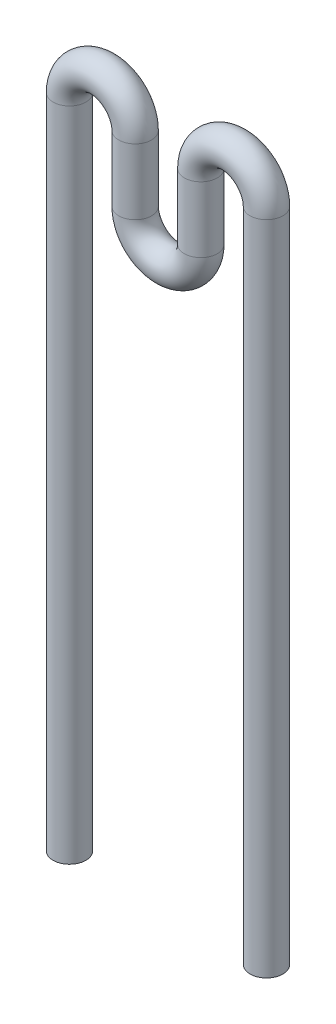
ISO-10303-21;
HEADER;
FILE_DESCRIPTION(('STEP AP214'),'2;1');
FILE_NAME('part.step','',(''),(''),'','','');
FILE_SCHEMA(('AUTOMOTIVE_DESIGN { 1 0 10303 214 1 1 1 1 }'));
ENDSEC;
DATA;
#1=APPLICATION_CONTEXT('core data for automotive mechanical design processes');
#2=APPLICATION_PROTOCOL_DEFINITION('international standard','automotive_design',2000,#1);
#3=PRODUCT_CONTEXT('',#1,'mechanical');
#4=PRODUCT('Part','Part','',(#3));
#5=PRODUCT_RELATED_PRODUCT_CATEGORY('part','',(#4));
#6=PRODUCT_DEFINITION_FORMATION('','',#4);
#7=PRODUCT_DEFINITION_CONTEXT('part definition',#1,'design');
#8=PRODUCT_DEFINITION('design','',#6,#7);
#9=PRODUCT_DEFINITION_SHAPE('','',#8);
#10=(LENGTH_UNIT() NAMED_UNIT(*) SI_UNIT(.MILLI.,.METRE.));
#11=(NAMED_UNIT(*) PLANE_ANGLE_UNIT() SI_UNIT($,.RADIAN.));
#12=(NAMED_UNIT(*) SI_UNIT($,.STERADIAN.) SOLID_ANGLE_UNIT());
#13=UNCERTAINTY_MEASURE_WITH_UNIT(LENGTH_MEASURE(1.E-05),#10,'distance_accuracy_value','');
#14=(GEOMETRIC_REPRESENTATION_CONTEXT(3) GLOBAL_UNCERTAINTY_ASSIGNED_CONTEXT((#13)) GLOBAL_UNIT_ASSIGNED_CONTEXT((#10,
#11,#12)) REPRESENTATION_CONTEXT('',''));
#15=CARTESIAN_POINT('',(0.,0.,0.));
#16=DIRECTION('',(0.,0.,1.));
#17=DIRECTION('',(1.,0.,0.));
#18=AXIS2_PLACEMENT_3D('',#15,#16,#17);
#19=CARTESIAN_POINT('',(0.,0.,0.));
#20=DIRECTION('',(0.,1.,0.));
#21=DIRECTION('',(0.,0.,1.));
#22=AXIS2_PLACEMENT_3D('',#19,#20,#21);
#23=PLANE('',#22);
#24=CARTESIAN_POINT('',(0.,0.,0.));
#25=DIRECTION('',(0.,1.,0.));
#26=DIRECTION('',(0.,0.,1.));
#27=AXIS2_PLACEMENT_3D('',#24,#25,#26);
#28=CIRCLE('',#27,5.);
#29=CARTESIAN_POINT('',(0.,0.,5.));
#30=VERTEX_POINT('',#29);
#31=EDGE_CURVE('E63',#30,#30,#28,.T.);
#32=ORIENTED_EDGE('',*,*,#31,.F.);
#33=EDGE_LOOP('',(#32));
#34=FACE_BOUND('',#33,.T.);
#35=ADVANCED_FACE('F35',(#34),#23,.F.);
#36=CARTESIAN_POINT('',(60.0000000000001,0.,0.));
#37=DIRECTION('',(0.,-1.,0.));
#38=DIRECTION('',(0.,0.,1.));
#39=AXIS2_PLACEMENT_3D('',#36,#37,#38);
#40=PLANE('',#39);
#41=CARTESIAN_POINT('',(60.0000000000001,0.,0.));
#42=DIRECTION('',(0.,-1.,0.));
#43=DIRECTION('',(0.,0.,1.));
#44=AXIS2_PLACEMENT_3D('',#41,#42,#43);
#45=CIRCLE('',#44,5.);
#46=CARTESIAN_POINT('',(60.0000000000001,0.,5.));
#47=VERTEX_POINT('',#46);
#48=EDGE_CURVE('E10',#47,#47,#45,.T.);
#49=ORIENTED_EDGE('',*,*,#48,.T.);
#50=EDGE_LOOP('',(#49));
#51=FACE_BOUND('',#50,.T.);
#52=ADVANCED_FACE('F70',(#51),#40,.T.);
#53=CARTESIAN_POINT('',(0.,0.,0.));
#54=DIRECTION('',(0.,1.,0.));
#55=DIRECTION('',(0.,0.,1.));
#56=AXIS2_PLACEMENT_3D('',#53,#54,#55);
#57=CYLINDRICAL_SURFACE('',#56,5.);
#58=CARTESIAN_POINT('',(0.,200.,0.));
#59=DIRECTION('',(0.,1.,0.));
#60=DIRECTION('',(0.,0.,1.));
#61=AXIS2_PLACEMENT_3D('',#58,#59,#60);
#62=CIRCLE('',#61,5.);
#63=CARTESIAN_POINT('',(-4.99999999999994,200.,0.));
#64=VERTEX_POINT('',#63);
#65=EDGE_CURVE('E60',#64,#64,#62,.T.);
#66=ORIENTED_EDGE('',*,*,#65,.F.);
#67=EDGE_LOOP('',(#66));
#68=FACE_BOUND('',#67,.T.);
#69=ORIENTED_EDGE('',*,*,#31,.T.);
#70=EDGE_LOOP('',(#69));
#71=FACE_BOUND('',#70,.T.);
#72=ADVANCED_FACE('F67',(#68,#71),#57,.T.);
#73=CARTESIAN_POINT('',(10.0000000000001,200.,0.));
#74=DIRECTION('',(0.,0.,-1.));
#75=DIRECTION('',(-1.,0.,0.));
#76=AXIS2_PLACEMENT_3D('',#73,#74,#75);
#77=TOROIDAL_SURFACE('',#76,10.0000000000001,5.);
#78=CARTESIAN_POINT('',(20.0000000000002,200.,0.));
#79=DIRECTION('',(0.,-1.,0.));
#80=DIRECTION('',(0.,0.,1.));
#81=AXIS2_PLACEMENT_3D('',#78,#79,#80);
#82=CIRCLE('',#81,5.);
#83=CARTESIAN_POINT('',(25.0000000000002,200.,0.));
#84=VERTEX_POINT('',#83);
#85=EDGE_CURVE('E57',#84,#84,#82,.T.);
#86=CARTESIAN_POINT('',(10.0000000000001,200.,0.));
#87=DIRECTION('',(0.,0.,-1.));
#88=DIRECTION('',(-1.,0.,0.));
#89=AXIS2_PLACEMENT_3D('',#86,#87,#88);
#90=CIRCLE('',#89,15.0000000000001);
#91=EDGE_CURVE('',#64,#84,#90,.T.);
#92=ORIENTED_EDGE('',*,*,#65,.T.);
#93=ORIENTED_EDGE('',*,*,#85,.F.);
#94=ORIENTED_EDGE('',*,*,#91,.T.);
#95=ORIENTED_EDGE('',*,*,#91,.F.);
#96=EDGE_LOOP('',(#92,#94,#93,#95));
#97=FACE_BOUND('',#96,.T.);
#98=ADVANCED_FACE('F96',(#97),#77,.T.);
#99=CARTESIAN_POINT('',(20.0000000000001,200.,0.));
#100=DIRECTION('',(0.,-1.,0.));
#101=DIRECTION('',(1.,0.,0.));
#102=AXIS2_PLACEMENT_3D('',#99,#100,#101);
#103=CYLINDRICAL_SURFACE('',#102,5.);
#104=CARTESIAN_POINT('',(20.0000000000001,180.,0.));
#105=DIRECTION('',(0.,-1.,0.));
#106=DIRECTION('',(0.,0.,1.));
#107=AXIS2_PLACEMENT_3D('',#104,#105,#106);
#108=CIRCLE('',#107,5.);
#109=CARTESIAN_POINT('',(15.0000000000001,180.,0.));
#110=VERTEX_POINT('',#109);
#111=EDGE_CURVE('E54',#110,#110,#108,.T.);
#112=ORIENTED_EDGE('',*,*,#111,.F.);
#113=EDGE_LOOP('',(#112));
#114=FACE_BOUND('',#113,.T.);
#115=ORIENTED_EDGE('',*,*,#85,.T.);
#116=EDGE_LOOP('',(#115));
#117=FACE_BOUND('',#116,.T.);
#118=ADVANCED_FACE('F92',(#114,#117),#103,.T.);
#119=CARTESIAN_POINT('',(30.0000000000001,180.,0.));
#120=DIRECTION('',(0.,0.,1.));
#121=DIRECTION('',(1.,0.,0.));
#122=AXIS2_PLACEMENT_3D('',#119,#120,#121);
#123=TOROIDAL_SURFACE('',#122,10.,5.);
#124=CARTESIAN_POINT('',(40.0000000000001,180.,0.));
#125=DIRECTION('',(0.,1.,0.));
#126=DIRECTION('',(0.,0.,1.));
#127=AXIS2_PLACEMENT_3D('',#124,#125,#126);
#128=CIRCLE('',#127,5.);
#129=CARTESIAN_POINT('',(45.0000000000001,180.,0.));
#130=VERTEX_POINT('',#129);
#131=EDGE_CURVE('E49',#130,#130,#128,.T.);
#132=CARTESIAN_POINT('',(30.0000000000001,180.,0.));
#133=DIRECTION('',(0.,0.,1.));
#134=DIRECTION('',(1.,0.,0.));
#135=AXIS2_PLACEMENT_3D('',#132,#133,#134);
#136=CIRCLE('',#135,15.);
#137=EDGE_CURVE('',#110,#130,#136,.T.);
#138=ORIENTED_EDGE('',*,*,#111,.T.);
#139=ORIENTED_EDGE('',*,*,#131,.F.);
#140=ORIENTED_EDGE('',*,*,#137,.T.);
#141=ORIENTED_EDGE('',*,*,#137,.F.);
#142=EDGE_LOOP('',(#138,#140,#139,#141));
#143=FACE_BOUND('',#142,.T.);
#144=ADVANCED_FACE('F88',(#143),#123,.T.);
#145=CARTESIAN_POINT('',(40.0000000000001,180.,0.));
#146=DIRECTION('',(0.,1.,0.));
#147=DIRECTION('',(0.,0.,1.));
#148=AXIS2_PLACEMENT_3D('',#145,#146,#147);
#149=CYLINDRICAL_SURFACE('',#148,5.);
#150=CARTESIAN_POINT('',(40.0000000000001,200.,0.));
#151=DIRECTION('',(0.,1.,0.));
#152=DIRECTION('',(0.,0.,1.));
#153=AXIS2_PLACEMENT_3D('',#150,#151,#152);
#154=CIRCLE('',#153,5.);
#155=CARTESIAN_POINT('',(35.0000000000001,200.,0.));
#156=VERTEX_POINT('',#155);
#157=EDGE_CURVE('E45',#156,#156,#154,.T.);
#158=ORIENTED_EDGE('',*,*,#157,.F.);
#159=EDGE_LOOP('',(#158));
#160=FACE_BOUND('',#159,.T.);
#161=ORIENTED_EDGE('',*,*,#131,.T.);
#162=EDGE_LOOP('',(#161));
#163=FACE_BOUND('',#162,.T.);
#164=ADVANCED_FACE('F82',(#160,#163),#149,.T.);
#165=CARTESIAN_POINT('',(50.0000000000001,200.,0.));
#166=DIRECTION('',(0.,0.,-1.));
#167=DIRECTION('',(-1.,0.,0.));
#168=AXIS2_PLACEMENT_3D('',#165,#166,#167);
#169=TOROIDAL_SURFACE('',#168,10.,5.);
#170=CARTESIAN_POINT('',(60.0000000000001,200.,0.));
#171=DIRECTION('',(0.,-1.,0.));
#172=DIRECTION('',(0.,0.,1.));
#173=AXIS2_PLACEMENT_3D('',#170,#171,#172);
#174=CIRCLE('',#173,5.);
#175=CARTESIAN_POINT('',(65.0000000000001,200.,0.));
#176=VERTEX_POINT('',#175);
#177=EDGE_CURVE('E41',#176,#176,#174,.T.);
#178=CARTESIAN_POINT('',(50.0000000000001,200.,0.));
#179=DIRECTION('',(0.,0.,-1.));
#180=DIRECTION('',(-1.,0.,0.));
#181=AXIS2_PLACEMENT_3D('',#178,#179,#180);
#182=CIRCLE('',#181,15.);
#183=EDGE_CURVE('',#156,#176,#182,.T.);
#184=ORIENTED_EDGE('',*,*,#157,.T.);
#185=ORIENTED_EDGE('',*,*,#177,.F.);
#186=ORIENTED_EDGE('',*,*,#183,.T.);
#187=ORIENTED_EDGE('',*,*,#183,.F.);
#188=EDGE_LOOP('',(#184,#186,#185,#187));
#189=FACE_BOUND('',#188,.T.);
#190=ADVANCED_FACE('F76',(#189),#169,.T.);
#191=CARTESIAN_POINT('',(60.0000000000001,200.,0.));
#192=DIRECTION('',(0.,-1.,0.));
#193=DIRECTION('',(1.,0.,0.));
#194=AXIS2_PLACEMENT_3D('',#191,#192,#193);
#195=CYLINDRICAL_SURFACE('',#194,5.);
#196=ORIENTED_EDGE('',*,*,#48,.F.);
#197=EDGE_LOOP('',(#196));
#198=FACE_BOUND('',#197,.T.);
#199=ORIENTED_EDGE('',*,*,#177,.T.);
#200=EDGE_LOOP('',(#199));
#201=FACE_BOUND('',#200,.T.);
#202=ADVANCED_FACE('F74',(#198,#201),#195,.T.);
#203=CLOSED_SHELL('',(#35,#52,#72,#98,#118,#144,#164,#190,#202));
#204=MANIFOLD_SOLID_BREP('B2',#203);
#205=ADVANCED_BREP_SHAPE_REPRESENTATION('',(#18,#204),#14);
#206=SHAPE_DEFINITION_REPRESENTATION(#9,#205);
ENDSEC;
END-ISO-10303-21;
